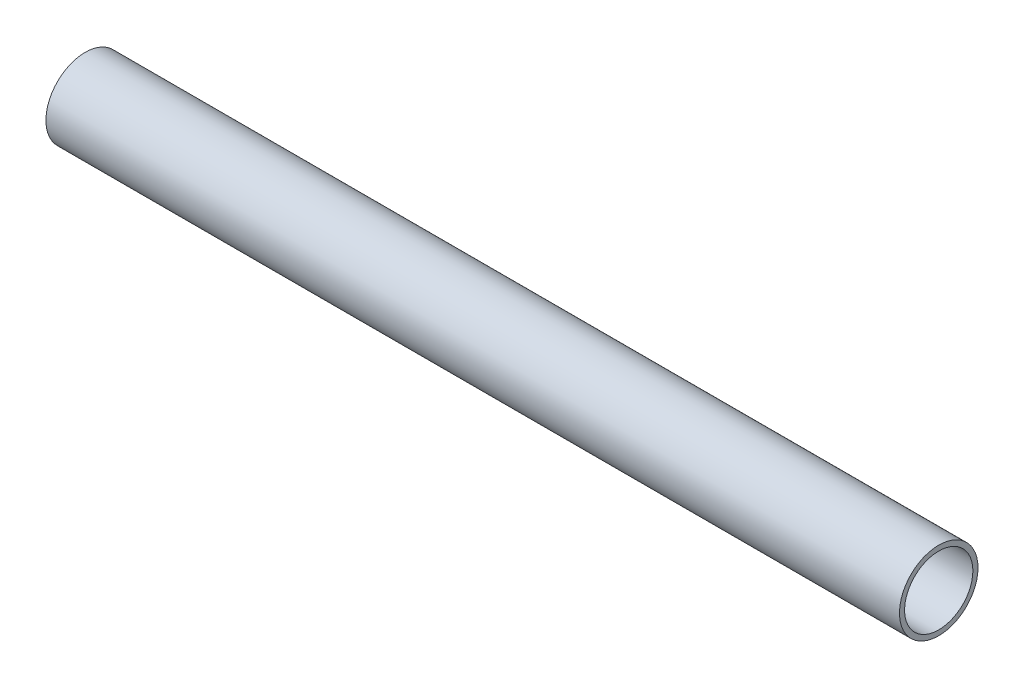
ISO-10303-21;
HEADER;
FILE_DESCRIPTION(('STEP AP214'),'2;1');
FILE_NAME('part.step','',(''),(''),'','','');
FILE_SCHEMA(('AUTOMOTIVE_DESIGN { 1 0 10303 214 1 1 1 1 }'));
ENDSEC;
DATA;
#1=APPLICATION_CONTEXT('core data for automotive mechanical design processes');
#2=APPLICATION_PROTOCOL_DEFINITION('international standard','automotive_design',2000,#1);
#3=PRODUCT_CONTEXT('',#1,'mechanical');
#4=PRODUCT('Part','Part','',(#3));
#5=PRODUCT_RELATED_PRODUCT_CATEGORY('part','',(#4));
#6=PRODUCT_DEFINITION_FORMATION('','',#4);
#7=PRODUCT_DEFINITION_CONTEXT('part definition',#1,'design');
#8=PRODUCT_DEFINITION('design','',#6,#7);
#9=PRODUCT_DEFINITION_SHAPE('','',#8);
#10=(LENGTH_UNIT() NAMED_UNIT(*) SI_UNIT(.MILLI.,.METRE.));
#11=(NAMED_UNIT(*) PLANE_ANGLE_UNIT() SI_UNIT($,.RADIAN.));
#12=(NAMED_UNIT(*) SI_UNIT($,.STERADIAN.) SOLID_ANGLE_UNIT());
#13=UNCERTAINTY_MEASURE_WITH_UNIT(LENGTH_MEASURE(1.E-05),#10,'distance_accuracy_value','');
#14=(GEOMETRIC_REPRESENTATION_CONTEXT(3) GLOBAL_UNCERTAINTY_ASSIGNED_CONTEXT((#13)) GLOBAL_UNIT_ASSIGNED_CONTEXT((#10,
#11,#12)) REPRESENTATION_CONTEXT('',''));
#15=CARTESIAN_POINT('',(0.,0.,0.));
#16=DIRECTION('',(0.,0.,1.));
#17=DIRECTION('',(1.,0.,0.));
#18=AXIS2_PLACEMENT_3D('',#15,#16,#17);
#19=CARTESIAN_POINT('',(250.,0.,0.));
#20=DIRECTION('',(1.,0.,0.));
#21=DIRECTION('',(0.,0.,-1.));
#22=AXIS2_PLACEMENT_3D('',#19,#20,#21);
#23=PLANE('',#22);
#24=CARTESIAN_POINT('',(250.,0.,0.));
#25=DIRECTION('',(1.,0.,0.));
#26=DIRECTION('',(0.,0.,-1.));
#27=AXIS2_PLACEMENT_3D('',#24,#25,#26);
#28=CIRCLE('',#27,11.5);
#29=CARTESIAN_POINT('',(250.,0.,-11.5));
#30=VERTEX_POINT('',#29);
#31=EDGE_CURVE('E11',#30,#30,#28,.T.);
#32=ORIENTED_EDGE('',*,*,#31,.T.);
#33=EDGE_LOOP('',(#32));
#34=FACE_BOUND('',#33,.T.);
#35=CARTESIAN_POINT('',(250.,0.,0.));
#36=DIRECTION('',(1.,0.,0.));
#37=DIRECTION('',(0.,0.,-1.));
#38=AXIS2_PLACEMENT_3D('',#35,#36,#37);
#39=CIRCLE('',#38,10.);
#40=CARTESIAN_POINT('',(250.,0.,-10.));
#41=VERTEX_POINT('',#40);
#42=EDGE_CURVE('E61',#41,#41,#39,.T.);
#43=ORIENTED_EDGE('',*,*,#42,.F.);
#44=EDGE_LOOP('',(#43));
#45=FACE_BOUND('',#44,.T.);
#46=ADVANCED_FACE('F50',(#34,#45),#23,.T.);
#47=CARTESIAN_POINT('',(0.,0.,0.));
#48=DIRECTION('',(1.,0.,0.));
#49=DIRECTION('',(0.,0.,-1.));
#50=AXIS2_PLACEMENT_3D('',#47,#48,#49);
#51=PLANE('',#50);
#52=CARTESIAN_POINT('',(0.,0.,0.));
#53=DIRECTION('',(1.,0.,0.));
#54=DIRECTION('',(0.,0.,-1.));
#55=AXIS2_PLACEMENT_3D('',#52,#53,#54);
#56=CIRCLE('',#55,11.5);
#57=CARTESIAN_POINT('',(0.,0.,-11.5));
#58=VERTEX_POINT('',#57);
#59=EDGE_CURVE('E54',#58,#58,#56,.T.);
#60=ORIENTED_EDGE('',*,*,#59,.F.);
#61=EDGE_LOOP('',(#60));
#62=FACE_BOUND('',#61,.T.);
#63=CARTESIAN_POINT('',(0.,0.,0.));
#64=DIRECTION('',(1.,0.,0.));
#65=DIRECTION('',(0.,0.,-1.));
#66=AXIS2_PLACEMENT_3D('',#63,#64,#65);
#67=CIRCLE('',#66,10.);
#68=CARTESIAN_POINT('',(0.,0.,-10.));
#69=VERTEX_POINT('',#68);
#70=EDGE_CURVE('E63',#69,#69,#67,.T.);
#71=ORIENTED_EDGE('',*,*,#70,.T.);
#72=EDGE_LOOP('',(#71));
#73=FACE_BOUND('',#72,.T.);
#74=ADVANCED_FACE('F73',(#62,#73),#51,.F.);
#75=CARTESIAN_POINT('',(250.,0.,0.));
#76=DIRECTION('',(-1.,0.,0.));
#77=DIRECTION('',(0.,0.,1.));
#78=AXIS2_PLACEMENT_3D('',#75,#76,#77);
#79=CYLINDRICAL_SURFACE('',#78,11.5);
#80=ORIENTED_EDGE('',*,*,#31,.F.);
#81=EDGE_LOOP('',(#80));
#82=FACE_BOUND('',#81,.T.);
#83=ORIENTED_EDGE('',*,*,#59,.T.);
#84=EDGE_LOOP('',(#83));
#85=FACE_BOUND('',#84,.T.);
#86=ADVANCED_FACE('F52',(#82,#85),#79,.T.);
#87=CARTESIAN_POINT('',(250.,0.,0.));
#88=DIRECTION('',(-1.,0.,0.));
#89=DIRECTION('',(0.,0.,1.));
#90=AXIS2_PLACEMENT_3D('',#87,#88,#89);
#91=CYLINDRICAL_SURFACE('',#90,10.);
#92=ORIENTED_EDGE('',*,*,#42,.T.);
#93=EDGE_LOOP('',(#92));
#94=FACE_BOUND('',#93,.T.);
#95=ORIENTED_EDGE('',*,*,#70,.F.);
#96=EDGE_LOOP('',(#95));
#97=FACE_BOUND('',#96,.T.);
#98=ADVANCED_FACE('F69',(#94,#97),#91,.F.);
#99=CLOSED_SHELL('',(#46,#74,#86,#98));
#100=MANIFOLD_SOLID_BREP('B2',#99);
#101=ADVANCED_BREP_SHAPE_REPRESENTATION('',(#18,#100),#14);
#102=SHAPE_DEFINITION_REPRESENTATION(#9,#101);
ENDSEC;
END-ISO-10303-21;
